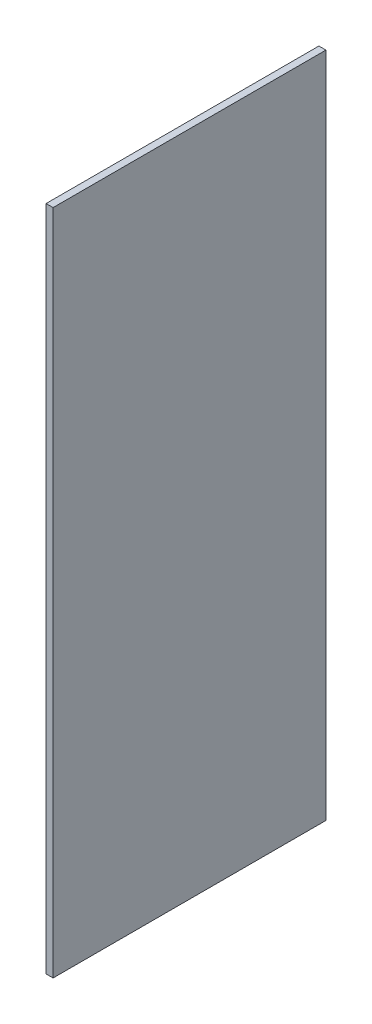
ISO-10303-21;
HEADER;
FILE_DESCRIPTION(('STEP AP214'),'2;1');
FILE_NAME('part.step','',(''),(''),'','','');
FILE_SCHEMA(('AUTOMOTIVE_DESIGN { 1 0 10303 214 1 1 1 1 }'));
ENDSEC;
DATA;
#1=APPLICATION_CONTEXT('core data for automotive mechanical design processes');
#2=APPLICATION_PROTOCOL_DEFINITION('international standard','automotive_design',2000,#1);
#3=PRODUCT_CONTEXT('',#1,'mechanical');
#4=PRODUCT('Part','Part','',(#3));
#5=PRODUCT_RELATED_PRODUCT_CATEGORY('part','',(#4));
#6=PRODUCT_DEFINITION_FORMATION('','',#4);
#7=PRODUCT_DEFINITION_CONTEXT('part definition',#1,'design');
#8=PRODUCT_DEFINITION('design','',#6,#7);
#9=PRODUCT_DEFINITION_SHAPE('','',#8);
#10=(LENGTH_UNIT() NAMED_UNIT(*) SI_UNIT(.MILLI.,.METRE.));
#11=(NAMED_UNIT(*) PLANE_ANGLE_UNIT() SI_UNIT($,.RADIAN.));
#12=(NAMED_UNIT(*) SI_UNIT($,.STERADIAN.) SOLID_ANGLE_UNIT());
#13=UNCERTAINTY_MEASURE_WITH_UNIT(LENGTH_MEASURE(1.E-05),#10,'distance_accuracy_value','');
#14=(GEOMETRIC_REPRESENTATION_CONTEXT(3) GLOBAL_UNCERTAINTY_ASSIGNED_CONTEXT((#13)) GLOBAL_UNIT_ASSIGNED_CONTEXT((#10,
#11,#12)) REPRESENTATION_CONTEXT('',''));
#15=CARTESIAN_POINT('',(0.,0.,0.));
#16=DIRECTION('',(0.,0.,1.));
#17=DIRECTION('',(1.,0.,0.));
#18=AXIS2_PLACEMENT_3D('',#15,#16,#17);
#19=CARTESIAN_POINT('',(0.,58.7500000000001,42.25));
#20=DIRECTION('',(-1.,0.,0.));
#21=DIRECTION('',(0.,0.,1.));
#22=AXIS2_PLACEMENT_3D('',#19,#20,#21);
#23=PLANE('',#22);
#24=DIRECTION('',(0.,1.,0.));
#25=VECTOR('',#24,1.);
#26=CARTESIAN_POINT('',(0.,98.5000000000002,39.55));
#27=LINE('',#26,#25);
#28=CARTESIAN_POINT('',(0.,8.55000000000011,39.55));
#29=VERTEX_POINT('',#28);
#30=CARTESIAN_POINT('',(0.,98.1500000000001,39.55));
#31=VERTEX_POINT('',#30);
#32=EDGE_CURVE('E101',#29,#31,#27,.T.);
#33=ORIENTED_EDGE('',*,*,#32,.T.);
#34=DIRECTION('',(0.,0.,-1.));
#35=VECTOR('',#34,1.);
#36=CARTESIAN_POINT('',(0.,98.1500000000001,5.50000000000002));
#37=LINE('',#36,#35);
#38=CARTESIAN_POINT('',(0.,98.1500000000001,6.10000000000002));
#39=VERTEX_POINT('',#38);
#40=EDGE_CURVE('E94',#31,#39,#37,.T.);
#41=ORIENTED_EDGE('',*,*,#40,.T.);
#42=DIRECTION('',(0.,-1.,0.));
#43=VECTOR('',#42,1.);
#44=CARTESIAN_POINT('',(0.,8.25000000000011,6.10000000000003));
#45=LINE('',#44,#43);
#46=CARTESIAN_POINT('',(0.,8.55000000000011,6.10000000000003));
#47=VERTEX_POINT('',#46);
#48=EDGE_CURVE('E78',#39,#47,#45,.T.);
#49=ORIENTED_EDGE('',*,*,#48,.T.);
#50=DIRECTION('',(0.,0.,1.));
#51=VECTOR('',#50,1.);
#52=CARTESIAN_POINT('',(0.,8.55000000000012,39.5));
#53=LINE('',#52,#51);
#54=EDGE_CURVE('E19',#47,#29,#53,.T.);
#55=ORIENTED_EDGE('',*,*,#54,.T.);
#56=EDGE_LOOP('',(#33,#41,#49,#55));
#57=FACE_BOUND('',#56,.T.);
#58=ADVANCED_FACE('F16',(#57),#23,.T.);
#59=CARTESIAN_POINT('',(0.,8.55000000000012,39.5));
#60=DIRECTION('',(0.,1.,0.));
#61=DIRECTION('',(0.,0.,1.));
#62=AXIS2_PLACEMENT_3D('',#59,#60,#61);
#63=PLANE('',#62);
#64=DIRECTION('',(0.,0.,1.));
#65=VECTOR('',#64,1.);
#66=CARTESIAN_POINT('',(0.5,8.55000000000012,42.25));
#67=LINE('',#66,#65);
#68=CARTESIAN_POINT('',(0.5,8.55000000000012,39.55));
#69=VERTEX_POINT('',#68);
#70=CARTESIAN_POINT('',(0.5,8.55000000000011,6.10000000000003));
#71=VERTEX_POINT('',#70);
#72=EDGE_CURVE('E107',#69,#71,#67,.F.);
#73=ORIENTED_EDGE('',*,*,#72,.F.);
#74=DIRECTION('',(1.,0.,0.));
#75=VECTOR('',#74,1.);
#76=CARTESIAN_POINT('',(0.,8.55000000000011,39.55));
#77=LINE('',#76,#75);
#78=EDGE_CURVE('E89',#69,#29,#77,.F.);
#79=ORIENTED_EDGE('',*,*,#78,.T.);
#80=ORIENTED_EDGE('',*,*,#54,.F.);
#81=DIRECTION('',(1.,0.,0.));
#82=VECTOR('',#81,1.);
#83=CARTESIAN_POINT('',(0.,8.55000000000011,6.10000000000003));
#84=LINE('',#83,#82);
#85=EDGE_CURVE('E87',#47,#71,#84,.T.);
#86=ORIENTED_EDGE('',*,*,#85,.T.);
#87=EDGE_LOOP('',(#73,#79,#80,#86));
#88=FACE_BOUND('',#87,.T.);
#89=ADVANCED_FACE('F86',(#88),#63,.F.);
#90=CARTESIAN_POINT('',(0.,8.25000000000011,6.10000000000003));
#91=DIRECTION('',(0.,0.,1.));
#92=DIRECTION('',(0.,-1.,0.));
#93=AXIS2_PLACEMENT_3D('',#90,#91,#92);
#94=PLANE('',#93);
#95=DIRECTION('',(0.,1.,0.));
#96=VECTOR('',#95,1.);
#97=CARTESIAN_POINT('',(0.5,58.7500000000001,6.10000000000003));
#98=LINE('',#97,#96);
#99=CARTESIAN_POINT('',(0.5,98.1500000000001,6.10000000000002));
#100=VERTEX_POINT('',#99);
#101=EDGE_CURVE('E93',#71,#100,#98,.T.);
#102=ORIENTED_EDGE('',*,*,#101,.F.);
#103=ORIENTED_EDGE('',*,*,#85,.F.);
#104=ORIENTED_EDGE('',*,*,#48,.F.);
#105=DIRECTION('',(1.,0.,0.));
#106=VECTOR('',#105,1.);
#107=CARTESIAN_POINT('',(0.,98.1500000000001,6.10000000000002));
#108=LINE('',#107,#106);
#109=EDGE_CURVE('E99',#39,#100,#108,.T.);
#110=ORIENTED_EDGE('',*,*,#109,.T.);
#111=EDGE_LOOP('',(#102,#103,#104,#110));
#112=FACE_BOUND('',#111,.T.);
#113=ADVANCED_FACE('F92',(#112),#94,.F.);
#114=CARTESIAN_POINT('',(0.,98.1500000000001,5.50000000000002));
#115=DIRECTION('',(0.,-1.,0.));
#116=DIRECTION('',(0.,0.,-1.));
#117=AXIS2_PLACEMENT_3D('',#114,#115,#116);
#118=PLANE('',#117);
#119=DIRECTION('',(0.,0.,1.));
#120=VECTOR('',#119,1.);
#121=CARTESIAN_POINT('',(0.5,98.1500000000001,42.25));
#122=LINE('',#121,#120);
#123=CARTESIAN_POINT('',(0.5,98.1500000000001,39.55));
#124=VERTEX_POINT('',#123);
#125=EDGE_CURVE('E110',#100,#124,#122,.T.);
#126=ORIENTED_EDGE('',*,*,#125,.F.);
#127=ORIENTED_EDGE('',*,*,#109,.F.);
#128=ORIENTED_EDGE('',*,*,#40,.F.);
#129=DIRECTION('',(1.,0.,0.));
#130=VECTOR('',#129,1.);
#131=CARTESIAN_POINT('',(0.,98.1500000000001,39.55));
#132=LINE('',#131,#130);
#133=EDGE_CURVE('E103',#31,#124,#132,.T.);
#134=ORIENTED_EDGE('',*,*,#133,.T.);
#135=EDGE_LOOP('',(#126,#127,#128,#134));
#136=FACE_BOUND('',#135,.T.);
#137=ADVANCED_FACE('F176',(#136),#118,.F.);
#138=CARTESIAN_POINT('',(0.,98.5000000000002,39.55));
#139=DIRECTION('',(0.,0.,-1.));
#140=DIRECTION('',(0.,1.,0.));
#141=AXIS2_PLACEMENT_3D('',#138,#139,#140);
#142=PLANE('',#141);
#143=DIRECTION('',(0.,1.,0.));
#144=VECTOR('',#143,1.);
#145=CARTESIAN_POINT('',(0.5,58.7500000000001,39.55));
#146=LINE('',#145,#144);
#147=EDGE_CURVE('E112',#124,#69,#146,.F.);
#148=ORIENTED_EDGE('',*,*,#147,.F.);
#149=ORIENTED_EDGE('',*,*,#133,.F.);
#150=ORIENTED_EDGE('',*,*,#32,.F.);
#151=ORIENTED_EDGE('',*,*,#78,.F.);
#152=EDGE_LOOP('',(#148,#149,#150,#151));
#153=FACE_BOUND('',#152,.T.);
#154=ADVANCED_FACE('F172',(#153),#142,.F.);
#155=CARTESIAN_POINT('',(0.5,58.7500000000001,42.25));
#156=DIRECTION('',(-1.,0.,0.));
#157=DIRECTION('',(0.,0.,1.));
#158=AXIS2_PLACEMENT_3D('',#155,#156,#157);
#159=PLANE('',#158);
#160=DIRECTION('',(0.,-1.,0.));
#161=VECTOR('',#160,1.);
#162=CARTESIAN_POINT('',(0.5,5.85000000000012,42.25));
#163=LINE('',#162,#161);
#164=CARTESIAN_POINT('',(0.5,100.85,42.25));
#165=VERTEX_POINT('',#164);
#166=CARTESIAN_POINT('',(0.5,5.85000000000012,42.25));
#167=VERTEX_POINT('',#166);
#168=EDGE_CURVE('E121',#165,#167,#163,.T.);
#169=ORIENTED_EDGE('',*,*,#168,.F.);
#170=DIRECTION('',(0.,0.,1.));
#171=VECTOR('',#170,1.);
#172=CARTESIAN_POINT('',(0.5,100.85,42.25));
#173=LINE('',#172,#171);
#174=CARTESIAN_POINT('',(0.5,100.85,3.40000000000002));
#175=VERTEX_POINT('',#174);
#176=EDGE_CURVE('E125',#175,#165,#173,.T.);
#177=ORIENTED_EDGE('',*,*,#176,.F.);
#178=DIRECTION('',(0.,1.,0.));
#179=VECTOR('',#178,1.);
#180=CARTESIAN_POINT('',(0.5,102.25,3.40000000000002));
#181=LINE('',#180,#179);
#182=CARTESIAN_POINT('',(0.5,5.85000000000011,3.40000000000003));
#183=VERTEX_POINT('',#182);
#184=EDGE_CURVE('E115',#183,#175,#181,.T.);
#185=ORIENTED_EDGE('',*,*,#184,.F.);
#186=DIRECTION('',(0.,0.,-1.));
#187=VECTOR('',#186,1.);
#188=CARTESIAN_POINT('',(0.5,5.85000000000011,2.25000000000004));
#189=LINE('',#188,#187);
#190=EDGE_CURVE('E117',#167,#183,#189,.T.);
#191=ORIENTED_EDGE('',*,*,#190,.F.);
#192=EDGE_LOOP('',(#169,#177,#185,#191));
#193=FACE_BOUND('',#192,.T.);
#194=ORIENTED_EDGE('',*,*,#125,.T.);
#195=ORIENTED_EDGE('',*,*,#147,.T.);
#196=ORIENTED_EDGE('',*,*,#72,.T.);
#197=ORIENTED_EDGE('',*,*,#101,.T.);
#198=EDGE_LOOP('',(#194,#195,#196,#197));
#199=FACE_BOUND('',#198,.T.);
#200=ADVANCED_FACE('F169',(#193,#199),#159,.T.);
#201=CARTESIAN_POINT('',(0.,102.25,3.40000000000002));
#202=DIRECTION('',(0.,0.,-1.));
#203=DIRECTION('',(0.,1.,0.));
#204=AXIS2_PLACEMENT_3D('',#201,#202,#203);
#205=PLANE('',#204);
#206=DIRECTION('',(0.,1.,0.));
#207=VECTOR('',#206,1.);
#208=CARTESIAN_POINT('',(1.5,58.7500000000001,3.40000000000002));
#209=LINE('',#208,#207);
#210=CARTESIAN_POINT('',(1.5,100.85,3.40000000000002));
#211=VERTEX_POINT('',#210);
#212=CARTESIAN_POINT('',(1.5,5.85000000000011,3.40000000000003));
#213=VERTEX_POINT('',#212);
#214=EDGE_CURVE('E131',#211,#213,#209,.F.);
#215=ORIENTED_EDGE('',*,*,#214,.T.);
#216=DIRECTION('',(1.,0.,0.));
#217=VECTOR('',#216,1.);
#218=CARTESIAN_POINT('',(0.,5.85000000000011,3.40000000000003));
#219=LINE('',#218,#217);
#220=EDGE_CURVE('E119',#183,#213,#219,.T.);
#221=ORIENTED_EDGE('',*,*,#220,.F.);
#222=ORIENTED_EDGE('',*,*,#184,.T.);
#223=DIRECTION('',(1.,0.,0.));
#224=VECTOR('',#223,1.);
#225=CARTESIAN_POINT('',(0.,100.85,3.40000000000002));
#226=LINE('',#225,#224);
#227=EDGE_CURVE('E128',#211,#175,#226,.F.);
#228=ORIENTED_EDGE('',*,*,#227,.F.);
#229=EDGE_LOOP('',(#215,#221,#222,#228));
#230=FACE_BOUND('',#229,.T.);
#231=ADVANCED_FACE('F151',(#230),#205,.T.);
#232=CARTESIAN_POINT('',(0.,5.85000000000011,2.25000000000004));
#233=DIRECTION('',(0.,-1.,0.));
#234=DIRECTION('',(0.,0.,-1.));
#235=AXIS2_PLACEMENT_3D('',#232,#233,#234);
#236=PLANE('',#235);
#237=DIRECTION('',(0.,0.,1.));
#238=VECTOR('',#237,1.);
#239=CARTESIAN_POINT('',(1.5,5.85000000000011,42.25));
#240=LINE('',#239,#238);
#241=CARTESIAN_POINT('',(1.5,5.85000000000012,42.25));
#242=VERTEX_POINT('',#241);
#243=EDGE_CURVE('E134',#213,#242,#240,.T.);
#244=ORIENTED_EDGE('',*,*,#243,.T.);
#245=DIRECTION('',(1.,0.,0.));
#246=VECTOR('',#245,1.);
#247=CARTESIAN_POINT('',(0.,5.85000000000012,42.25));
#248=LINE('',#247,#246);
#249=EDGE_CURVE('E123',#167,#242,#248,.T.);
#250=ORIENTED_EDGE('',*,*,#249,.F.);
#251=ORIENTED_EDGE('',*,*,#190,.T.);
#252=ORIENTED_EDGE('',*,*,#220,.T.);
#253=EDGE_LOOP('',(#244,#250,#251,#252));
#254=FACE_BOUND('',#253,.T.);
#255=ADVANCED_FACE('F146',(#254),#236,.T.);
#256=CARTESIAN_POINT('',(0.,5.85000000000012,42.25));
#257=DIRECTION('',(0.,0.,1.));
#258=DIRECTION('',(0.,-1.,0.));
#259=AXIS2_PLACEMENT_3D('',#256,#257,#258);
#260=PLANE('',#259);
#261=DIRECTION('',(0.,1.,0.));
#262=VECTOR('',#261,1.);
#263=CARTESIAN_POINT('',(1.5,58.7500000000001,42.25));
#264=LINE('',#263,#262);
#265=CARTESIAN_POINT('',(1.5,100.85,42.25));
#266=VERTEX_POINT('',#265);
#267=EDGE_CURVE('E25',#242,#266,#264,.T.);
#268=ORIENTED_EDGE('',*,*,#267,.T.);
#269=DIRECTION('',(1.,0.,0.));
#270=VECTOR('',#269,1.);
#271=CARTESIAN_POINT('',(0.,100.85,42.25));
#272=LINE('',#271,#270);
#273=EDGE_CURVE('E33',#165,#266,#272,.T.);
#274=ORIENTED_EDGE('',*,*,#273,.F.);
#275=ORIENTED_EDGE('',*,*,#168,.T.);
#276=ORIENTED_EDGE('',*,*,#249,.T.);
#277=EDGE_LOOP('',(#268,#274,#275,#276));
#278=FACE_BOUND('',#277,.T.);
#279=ADVANCED_FACE('F140',(#278),#260,.T.);
#280=CARTESIAN_POINT('',(0.,100.85,42.25));
#281=DIRECTION('',(0.,1.,0.));
#282=DIRECTION('',(0.,0.,1.));
#283=AXIS2_PLACEMENT_3D('',#280,#281,#282);
#284=PLANE('',#283);
#285=DIRECTION('',(0.,0.,1.));
#286=VECTOR('',#285,1.);
#287=CARTESIAN_POINT('',(1.5,100.85,42.25));
#288=LINE('',#287,#286);
#289=EDGE_CURVE('E11',#266,#211,#288,.F.);
#290=ORIENTED_EDGE('',*,*,#289,.T.);
#291=ORIENTED_EDGE('',*,*,#227,.T.);
#292=ORIENTED_EDGE('',*,*,#176,.T.);
#293=ORIENTED_EDGE('',*,*,#273,.T.);
#294=EDGE_LOOP('',(#290,#291,#292,#293));
#295=FACE_BOUND('',#294,.T.);
#296=ADVANCED_FACE('F154',(#295),#284,.T.);
#297=CARTESIAN_POINT('',(1.5,58.7500000000001,42.25));
#298=DIRECTION('',(-1.,0.,0.));
#299=DIRECTION('',(0.,0.,1.));
#300=AXIS2_PLACEMENT_3D('',#297,#298,#299);
#301=PLANE('',#300);
#302=ORIENTED_EDGE('',*,*,#267,.F.);
#303=ORIENTED_EDGE('',*,*,#243,.F.);
#304=ORIENTED_EDGE('',*,*,#214,.F.);
#305=ORIENTED_EDGE('',*,*,#289,.F.);
#306=EDGE_LOOP('',(#302,#303,#304,#305));
#307=FACE_BOUND('',#306,.T.);
#308=ADVANCED_FACE('F144',(#307),#301,.F.);
#309=CLOSED_SHELL('',(#58,#89,#113,#137,#154,#200,#231,#255,#279,#296,#308));
#310=MANIFOLD_SOLID_BREP('B1',#309);
#311=ADVANCED_BREP_SHAPE_REPRESENTATION('',(#18,#310),#14);
#312=SHAPE_DEFINITION_REPRESENTATION(#9,#311);
ENDSEC;
END-ISO-10303-21;
